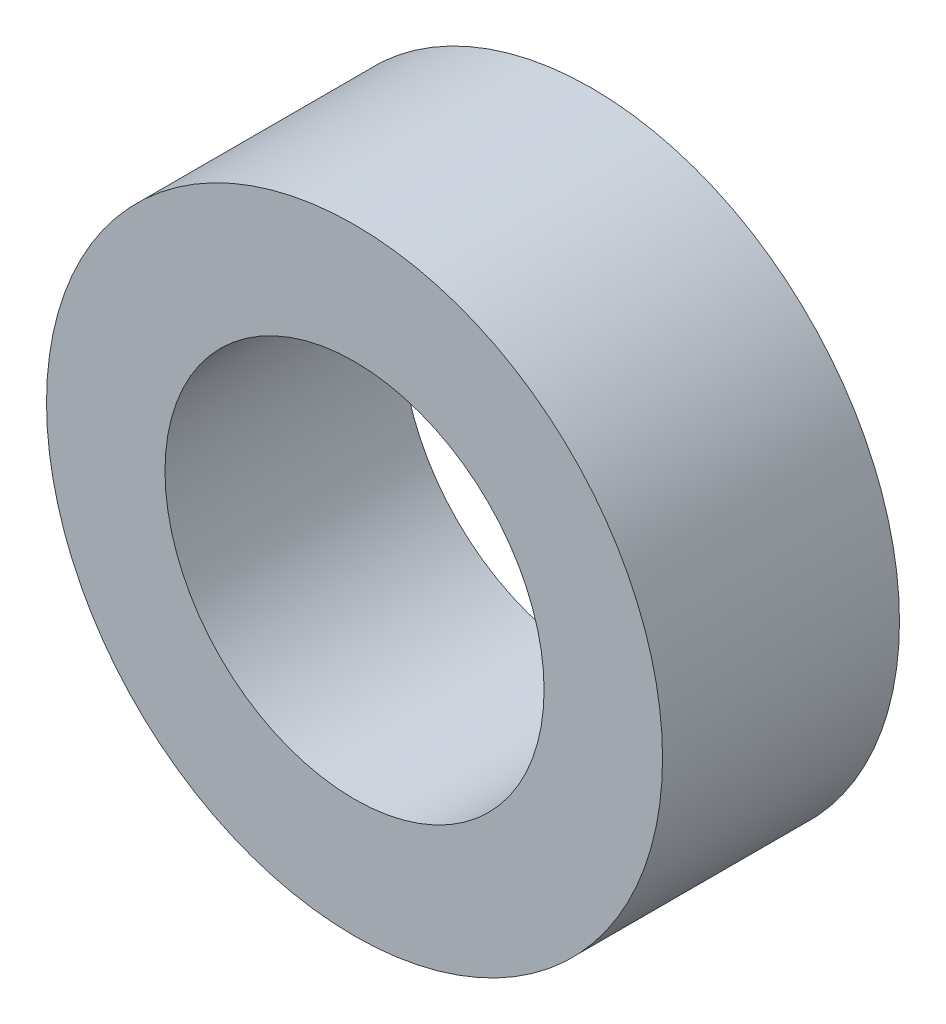
ISO-10303-21;
HEADER;
FILE_DESCRIPTION(('STEP AP214'),'2;1');
FILE_NAME('part.step','',(''),(''),'','','');
FILE_SCHEMA(('AUTOMOTIVE_DESIGN { 1 0 10303 214 1 1 1 1 }'));
ENDSEC;
DATA;
#1=APPLICATION_CONTEXT('core data for automotive mechanical design processes');
#2=APPLICATION_PROTOCOL_DEFINITION('international standard','automotive_design',2000,#1);
#3=PRODUCT_CONTEXT('',#1,'mechanical');
#4=PRODUCT('Part','Part','',(#3));
#5=PRODUCT_RELATED_PRODUCT_CATEGORY('part','',(#4));
#6=PRODUCT_DEFINITION_FORMATION('','',#4);
#7=PRODUCT_DEFINITION_CONTEXT('part definition',#1,'design');
#8=PRODUCT_DEFINITION('design','',#6,#7);
#9=PRODUCT_DEFINITION_SHAPE('','',#8);
#10=(LENGTH_UNIT() NAMED_UNIT(*) SI_UNIT(.MILLI.,.METRE.));
#11=(NAMED_UNIT(*) PLANE_ANGLE_UNIT() SI_UNIT($,.RADIAN.));
#12=(NAMED_UNIT(*) SI_UNIT($,.STERADIAN.) SOLID_ANGLE_UNIT());
#13=UNCERTAINTY_MEASURE_WITH_UNIT(LENGTH_MEASURE(1.E-05),#10,'distance_accuracy_value','');
#14=(GEOMETRIC_REPRESENTATION_CONTEXT(3) GLOBAL_UNCERTAINTY_ASSIGNED_CONTEXT((#13)) GLOBAL_UNIT_ASSIGNED_CONTEXT((#10,
#11,#12)) REPRESENTATION_CONTEXT('',''));
#15=CARTESIAN_POINT('',(0.,0.,0.));
#16=DIRECTION('',(0.,0.,1.));
#17=DIRECTION('',(1.,0.,0.));
#18=AXIS2_PLACEMENT_3D('',#15,#16,#17);
#19=CARTESIAN_POINT('',(0.,0.,10.));
#20=DIRECTION('',(0.,0.,1.));
#21=DIRECTION('',(1.,0.,0.));
#22=AXIS2_PLACEMENT_3D('',#19,#20,#21);
#23=PLANE('',#22);
#24=CARTESIAN_POINT('',(0.,0.,10.));
#25=DIRECTION('',(0.,0.,1.));
#26=DIRECTION('',(1.,0.,0.));
#27=AXIS2_PLACEMENT_3D('',#24,#25,#26);
#28=CIRCLE('',#27,13.);
#29=CARTESIAN_POINT('',(13.,0.,10.));
#30=VERTEX_POINT('',#29);
#31=EDGE_CURVE('E10',#30,#30,#28,.T.);
#32=ORIENTED_EDGE('',*,*,#31,.T.);
#33=EDGE_LOOP('',(#32));
#34=FACE_BOUND('',#33,.T.);
#35=CARTESIAN_POINT('',(0.,0.,10.));
#36=DIRECTION('',(0.,0.,1.));
#37=DIRECTION('',(1.,0.,0.));
#38=AXIS2_PLACEMENT_3D('',#35,#36,#37);
#39=CIRCLE('',#38,8.);
#40=CARTESIAN_POINT('',(8.,0.,10.));
#41=VERTEX_POINT('',#40);
#42=EDGE_CURVE('E50',#41,#41,#39,.T.);
#43=ORIENTED_EDGE('',*,*,#42,.F.);
#44=EDGE_LOOP('',(#43));
#45=FACE_BOUND('',#44,.T.);
#46=ADVANCED_FACE('F37',(#34,#45),#23,.T.);
#47=CARTESIAN_POINT('',(0.,0.,0.));
#48=DIRECTION('',(0.,0.,1.));
#49=DIRECTION('',(1.,0.,0.));
#50=AXIS2_PLACEMENT_3D('',#47,#48,#49);
#51=PLANE('',#50);
#52=CARTESIAN_POINT('',(0.,0.,0.));
#53=DIRECTION('',(0.,0.,1.));
#54=DIRECTION('',(1.,0.,0.));
#55=AXIS2_PLACEMENT_3D('',#52,#53,#54);
#56=CIRCLE('',#55,13.);
#57=CARTESIAN_POINT('',(13.,0.,0.));
#58=VERTEX_POINT('',#57);
#59=EDGE_CURVE('E41',#58,#58,#56,.T.);
#60=ORIENTED_EDGE('',*,*,#59,.F.);
#61=EDGE_LOOP('',(#60));
#62=FACE_BOUND('',#61,.T.);
#63=CARTESIAN_POINT('',(0.,0.,0.));
#64=DIRECTION('',(0.,0.,1.));
#65=DIRECTION('',(1.,0.,0.));
#66=AXIS2_PLACEMENT_3D('',#63,#64,#65);
#67=CIRCLE('',#66,8.);
#68=CARTESIAN_POINT('',(8.,0.,0.));
#69=VERTEX_POINT('',#68);
#70=EDGE_CURVE('E52',#69,#69,#67,.T.);
#71=ORIENTED_EDGE('',*,*,#70,.T.);
#72=EDGE_LOOP('',(#71));
#73=FACE_BOUND('',#72,.T.);
#74=ADVANCED_FACE('F64',(#62,#73),#51,.F.);
#75=CARTESIAN_POINT('',(0.,0.,10.));
#76=DIRECTION('',(0.,0.,-1.));
#77=DIRECTION('',(-1.,0.,0.));
#78=AXIS2_PLACEMENT_3D('',#75,#76,#77);
#79=CYLINDRICAL_SURFACE('',#78,13.);
#80=ORIENTED_EDGE('',*,*,#31,.F.);
#81=EDGE_LOOP('',(#80));
#82=FACE_BOUND('',#81,.T.);
#83=ORIENTED_EDGE('',*,*,#59,.T.);
#84=EDGE_LOOP('',(#83));
#85=FACE_BOUND('',#84,.T.);
#86=ADVANCED_FACE('F39',(#82,#85),#79,.T.);
#87=CARTESIAN_POINT('',(0.,0.,10.));
#88=DIRECTION('',(0.,0.,-1.));
#89=DIRECTION('',(-1.,0.,0.));
#90=AXIS2_PLACEMENT_3D('',#87,#88,#89);
#91=CYLINDRICAL_SURFACE('',#90,8.);
#92=ORIENTED_EDGE('',*,*,#42,.T.);
#93=EDGE_LOOP('',(#92));
#94=FACE_BOUND('',#93,.T.);
#95=ORIENTED_EDGE('',*,*,#70,.F.);
#96=EDGE_LOOP('',(#95));
#97=FACE_BOUND('',#96,.T.);
#98=ADVANCED_FACE('F60',(#94,#97),#91,.F.);
#99=CLOSED_SHELL('',(#46,#74,#86,#98));
#100=MANIFOLD_SOLID_BREP('B2',#99);
#101=ADVANCED_BREP_SHAPE_REPRESENTATION('',(#18,#100),#14);
#102=SHAPE_DEFINITION_REPRESENTATION(#9,#101);
ENDSEC;
END-ISO-10303-21;
